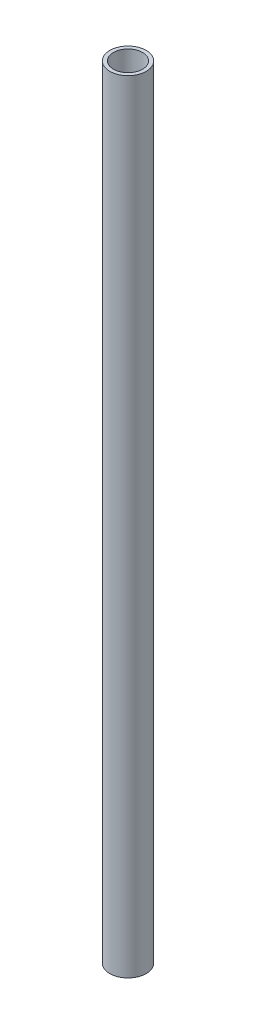
ISO-10303-21;
HEADER;
FILE_DESCRIPTION(('STEP AP214'),'2;1');
FILE_NAME('part.step','',(''),(''),'','','');
FILE_SCHEMA(('AUTOMOTIVE_DESIGN { 1 0 10303 214 1 1 1 1 }'));
ENDSEC;
DATA;
#1=APPLICATION_CONTEXT('core data for automotive mechanical design processes');
#2=APPLICATION_PROTOCOL_DEFINITION('international standard','automotive_design',2000,#1);
#3=PRODUCT_CONTEXT('',#1,'mechanical');
#4=PRODUCT('Part','Part','',(#3));
#5=PRODUCT_RELATED_PRODUCT_CATEGORY('part','',(#4));
#6=PRODUCT_DEFINITION_FORMATION('','',#4);
#7=PRODUCT_DEFINITION_CONTEXT('part definition',#1,'design');
#8=PRODUCT_DEFINITION('design','',#6,#7);
#9=PRODUCT_DEFINITION_SHAPE('','',#8);
#10=(LENGTH_UNIT() NAMED_UNIT(*) SI_UNIT(.MILLI.,.METRE.));
#11=(NAMED_UNIT(*) PLANE_ANGLE_UNIT() SI_UNIT($,.RADIAN.));
#12=(NAMED_UNIT(*) SI_UNIT($,.STERADIAN.) SOLID_ANGLE_UNIT());
#13=UNCERTAINTY_MEASURE_WITH_UNIT(LENGTH_MEASURE(1.E-05),#10,'distance_accuracy_value','');
#14=(GEOMETRIC_REPRESENTATION_CONTEXT(3) GLOBAL_UNCERTAINTY_ASSIGNED_CONTEXT((#13)) GLOBAL_UNIT_ASSIGNED_CONTEXT((#10,
#11,#12)) REPRESENTATION_CONTEXT('',''));
#15=CARTESIAN_POINT('',(0.,0.,0.));
#16=DIRECTION('',(0.,0.,1.));
#17=DIRECTION('',(1.,0.,0.));
#18=AXIS2_PLACEMENT_3D('',#15,#16,#17);
#19=CARTESIAN_POINT('',(0.,-107.5,0.));
#20=DIRECTION('',(0.,1.,0.));
#21=DIRECTION('',(-1.,0.,0.));
#22=AXIS2_PLACEMENT_3D('',#19,#20,#21);
#23=CYLINDRICAL_SURFACE('',#22,4.);
#24=CARTESIAN_POINT('',(0.,-107.5,0.));
#25=DIRECTION('',(0.,-1.,0.));
#26=DIRECTION('',(1.,0.,0.));
#27=AXIS2_PLACEMENT_3D('',#24,#25,#26);
#28=CIRCLE('',#27,4.);
#29=CARTESIAN_POINT('',(4.00000000000003,-107.5,0.));
#30=VERTEX_POINT('',#29);
#31=EDGE_CURVE('E43',#30,#30,#28,.T.);
#32=ORIENTED_EDGE('',*,*,#31,.T.);
#33=EDGE_LOOP('',(#32));
#34=FACE_BOUND('',#33,.T.);
#35=CARTESIAN_POINT('',(0.,107.5,0.));
#36=DIRECTION('',(0.,-1.,0.));
#37=DIRECTION('',(1.,0.,0.));
#38=AXIS2_PLACEMENT_3D('',#35,#36,#37);
#39=CIRCLE('',#38,4.);
#40=CARTESIAN_POINT('',(3.99999999999996,107.5,0.));
#41=VERTEX_POINT('',#40);
#42=EDGE_CURVE('E49',#41,#41,#39,.T.);
#43=ORIENTED_EDGE('',*,*,#42,.F.);
#44=EDGE_LOOP('',(#43));
#45=FACE_BOUND('',#44,.T.);
#46=ADVANCED_FACE('F36',(#34,#45),#23,.F.);
#47=CARTESIAN_POINT('',(0.,-107.5,0.));
#48=DIRECTION('',(0.,1.,0.));
#49=DIRECTION('',(-1.,0.,0.));
#50=AXIS2_PLACEMENT_3D('',#47,#48,#49);
#51=CYLINDRICAL_SURFACE('',#50,5.);
#52=CARTESIAN_POINT('',(0.,-107.5,0.));
#53=DIRECTION('',(0.,-1.,0.));
#54=DIRECTION('',(1.,0.,0.));
#55=AXIS2_PLACEMENT_3D('',#52,#53,#54);
#56=CIRCLE('',#55,5.);
#57=CARTESIAN_POINT('',(5.00000000000003,-107.5,0.));
#58=VERTEX_POINT('',#57);
#59=EDGE_CURVE('E11',#58,#58,#56,.T.);
#60=ORIENTED_EDGE('',*,*,#59,.F.);
#61=EDGE_LOOP('',(#60));
#62=FACE_BOUND('',#61,.T.);
#63=CARTESIAN_POINT('',(0.,107.5,0.));
#64=DIRECTION('',(0.,-1.,0.));
#65=DIRECTION('',(1.,0.,0.));
#66=AXIS2_PLACEMENT_3D('',#63,#64,#65);
#67=CIRCLE('',#66,5.);
#68=CARTESIAN_POINT('',(4.99999999999996,107.5,0.));
#69=VERTEX_POINT('',#68);
#70=EDGE_CURVE('E39',#69,#69,#67,.T.);
#71=ORIENTED_EDGE('',*,*,#70,.T.);
#72=EDGE_LOOP('',(#71));
#73=FACE_BOUND('',#72,.T.);
#74=ADVANCED_FACE('F56',(#62,#73),#51,.T.);
#75=CARTESIAN_POINT('',(0.,-107.5,0.));
#76=DIRECTION('',(0.,-1.,0.));
#77=DIRECTION('',(1.,0.,0.));
#78=AXIS2_PLACEMENT_3D('',#75,#76,#77);
#79=PLANE('',#78);
#80=ORIENTED_EDGE('',*,*,#31,.F.);
#81=EDGE_LOOP('',(#80));
#82=FACE_BOUND('',#81,.T.);
#83=ORIENTED_EDGE('',*,*,#59,.T.);
#84=EDGE_LOOP('',(#83));
#85=FACE_BOUND('',#84,.T.);
#86=ADVANCED_FACE('F60',(#82,#85),#79,.T.);
#87=CARTESIAN_POINT('',(0.,107.5,0.));
#88=DIRECTION('',(0.,-1.,0.));
#89=DIRECTION('',(1.,0.,0.));
#90=AXIS2_PLACEMENT_3D('',#87,#88,#89);
#91=PLANE('',#90);
#92=ORIENTED_EDGE('',*,*,#42,.T.);
#93=EDGE_LOOP('',(#92));
#94=FACE_BOUND('',#93,.T.);
#95=ORIENTED_EDGE('',*,*,#70,.F.);
#96=EDGE_LOOP('',(#95));
#97=FACE_BOUND('',#96,.T.);
#98=ADVANCED_FACE('F58',(#94,#97),#91,.F.);
#99=CLOSED_SHELL('',(#46,#74,#86,#98));
#100=MANIFOLD_SOLID_BREP('B2',#99);
#101=ADVANCED_BREP_SHAPE_REPRESENTATION('',(#18,#100),#14);
#102=SHAPE_DEFINITION_REPRESENTATION(#9,#101);
ENDSEC;
END-ISO-10303-21;
